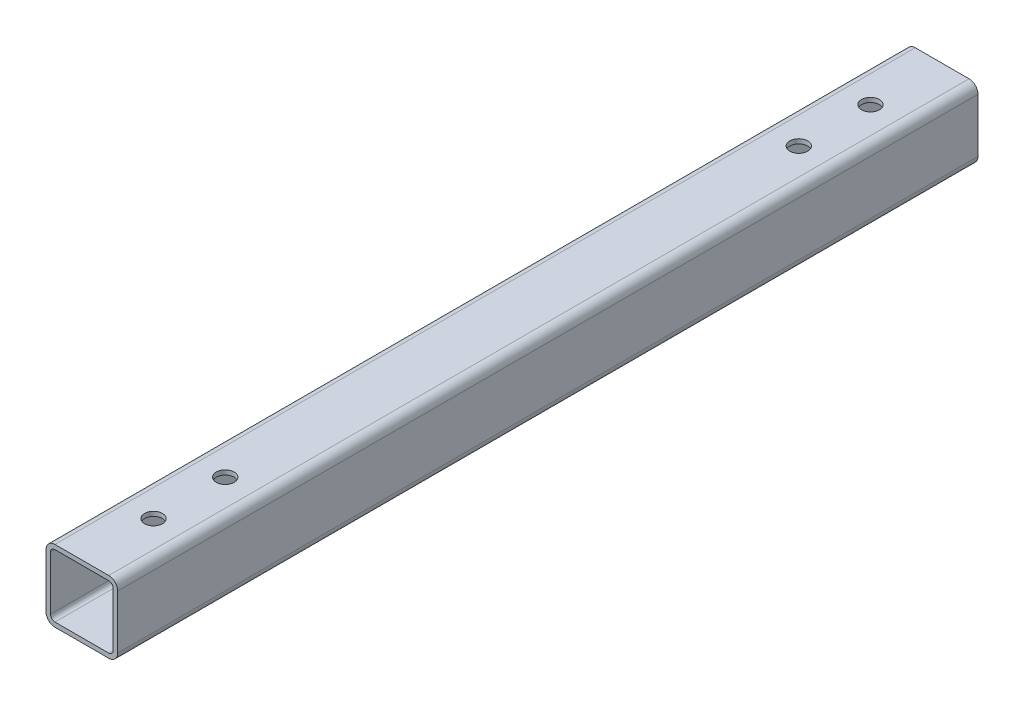
ISO-10303-21;
HEADER;
FILE_DESCRIPTION(('STEP AP214'),'2;1');
FILE_NAME('part.step','',(''),(''),'','','');
FILE_SCHEMA(('AUTOMOTIVE_DESIGN { 1 0 10303 214 1 1 1 1 }'));
ENDSEC;
DATA;
#1=APPLICATION_CONTEXT('core data for automotive mechanical design processes');
#2=APPLICATION_PROTOCOL_DEFINITION('international standard','automotive_design',2000,#1);
#3=PRODUCT_CONTEXT('',#1,'mechanical');
#4=PRODUCT('Part','Part','',(#3));
#5=PRODUCT_RELATED_PRODUCT_CATEGORY('part','',(#4));
#6=PRODUCT_DEFINITION_FORMATION('','',#4);
#7=PRODUCT_DEFINITION_CONTEXT('part definition',#1,'design');
#8=PRODUCT_DEFINITION('design','',#6,#7);
#9=PRODUCT_DEFINITION_SHAPE('','',#8);
#10=(LENGTH_UNIT() NAMED_UNIT(*) SI_UNIT(.MILLI.,.METRE.));
#11=(NAMED_UNIT(*) PLANE_ANGLE_UNIT() SI_UNIT($,.RADIAN.));
#12=(NAMED_UNIT(*) SI_UNIT($,.STERADIAN.) SOLID_ANGLE_UNIT());
#13=UNCERTAINTY_MEASURE_WITH_UNIT(LENGTH_MEASURE(1.E-05),#10,'distance_accuracy_value','');
#14=(GEOMETRIC_REPRESENTATION_CONTEXT(3) GLOBAL_UNCERTAINTY_ASSIGNED_CONTEXT((#13)) GLOBAL_UNIT_ASSIGNED_CONTEXT((#10,
#11,#12)) REPRESENTATION_CONTEXT('',''));
#15=CARTESIAN_POINT('',(0.,0.,0.));
#16=DIRECTION('',(0.,0.,1.));
#17=DIRECTION('',(1.,0.,0.));
#18=AXIS2_PLACEMENT_3D('',#15,#16,#17);
#19=CARTESIAN_POINT('',(-12.7,-12.7,-152.4));
#20=DIRECTION('',(0.,0.,-1.));
#21=DIRECTION('',(-1.,0.,0.));
#22=AXIS2_PLACEMENT_3D('',#19,#20,#21);
#23=PLANE('',#22);
#24=DIRECTION('',(0.,-1.,0.));
#25=VECTOR('',#24,1.);
#26=CARTESIAN_POINT('',(-12.7,12.7,-152.4));
#27=LINE('',#26,#25);
#28=CARTESIAN_POINT('',(-12.7,9.525,-152.4));
#29=VERTEX_POINT('',#28);
#30=CARTESIAN_POINT('',(-12.7,-9.525,-152.4));
#31=VERTEX_POINT('',#30);
#32=EDGE_CURVE('E232',#29,#31,#27,.T.);
#33=ORIENTED_EDGE('',*,*,#32,.F.);
#34=CARTESIAN_POINT('',(-9.525,9.525,-152.4));
#35=DIRECTION('',(0.,0.,-1.));
#36=DIRECTION('',(-1.,0.,0.));
#37=AXIS2_PLACEMENT_3D('',#34,#35,#36);
#38=CIRCLE('',#37,3.175);
#39=CARTESIAN_POINT('',(-9.525,12.7,-152.4));
#40=VERTEX_POINT('',#39);
#41=EDGE_CURVE('E258',#29,#40,#38,.T.);
#42=ORIENTED_EDGE('',*,*,#41,.T.);
#43=DIRECTION('',(1.,0.,0.));
#44=VECTOR('',#43,1.);
#45=CARTESIAN_POINT('',(-12.7,12.7,-152.4));
#46=LINE('',#45,#44);
#47=CARTESIAN_POINT('',(9.525,12.7,-152.4));
#48=VERTEX_POINT('',#47);
#49=EDGE_CURVE('E219',#40,#48,#46,.T.);
#50=ORIENTED_EDGE('',*,*,#49,.T.);
#51=CARTESIAN_POINT('',(9.525,9.525,-152.4));
#52=DIRECTION('',(0.,0.,-1.));
#53=DIRECTION('',(-1.,0.,0.));
#54=AXIS2_PLACEMENT_3D('',#51,#52,#53);
#55=CIRCLE('',#54,3.175);
#56=CARTESIAN_POINT('',(12.7,9.525,-152.4));
#57=VERTEX_POINT('',#56);
#58=EDGE_CURVE('E254',#48,#57,#55,.T.);
#59=ORIENTED_EDGE('',*,*,#58,.T.);
#60=DIRECTION('',(0.,1.,0.));
#61=VECTOR('',#60,1.);
#62=CARTESIAN_POINT('',(12.7,-12.7,-152.4));
#63=LINE('',#62,#61);
#64=CARTESIAN_POINT('',(12.7,-9.525,-152.4));
#65=VERTEX_POINT('',#64);
#66=EDGE_CURVE('E240',#65,#57,#63,.T.);
#67=ORIENTED_EDGE('',*,*,#66,.F.);
#68=CARTESIAN_POINT('',(9.525,-9.525,-152.4));
#69=DIRECTION('',(0.,0.,-1.));
#70=DIRECTION('',(-1.,0.,0.));
#71=AXIS2_PLACEMENT_3D('',#68,#69,#70);
#72=CIRCLE('',#71,3.175);
#73=CARTESIAN_POINT('',(9.525,-12.7,-152.4));
#74=VERTEX_POINT('',#73);
#75=EDGE_CURVE('E252',#65,#74,#72,.T.);
#76=ORIENTED_EDGE('',*,*,#75,.T.);
#77=DIRECTION('',(-1.,0.,0.));
#78=VECTOR('',#77,1.);
#79=CARTESIAN_POINT('',(12.7,-12.7,-152.4));
#80=LINE('',#79,#78);
#81=CARTESIAN_POINT('',(-9.52499999999999,-12.7,-152.4));
#82=VERTEX_POINT('',#81);
#83=EDGE_CURVE('E236',#74,#82,#80,.T.);
#84=ORIENTED_EDGE('',*,*,#83,.T.);
#85=CARTESIAN_POINT('',(-9.52499999999999,-9.525,-152.4));
#86=DIRECTION('',(0.,0.,-1.));
#87=DIRECTION('',(-1.,0.,0.));
#88=AXIS2_PLACEMENT_3D('',#85,#86,#87);
#89=CIRCLE('',#88,3.175);
#90=EDGE_CURVE('E256',#82,#31,#89,.T.);
#91=ORIENTED_EDGE('',*,*,#90,.T.);
#92=EDGE_LOOP('',(#33,#42,#50,#59,#67,#76,#84,#91));
#93=FACE_BOUND('',#92,.T.);
#94=CARTESIAN_POINT('',(-9.525,9.525,-152.4));
#95=DIRECTION('',(0.,0.,-1.));
#96=DIRECTION('',(-1.,0.,0.));
#97=AXIS2_PLACEMENT_3D('',#94,#95,#96);
#98=CIRCLE('',#97,1.5875);
#99=CARTESIAN_POINT('',(-11.1125,9.525,-152.4));
#100=VERTEX_POINT('',#99);
#101=CARTESIAN_POINT('',(-9.525,11.1125,-152.4));
#102=VERTEX_POINT('',#101);
#103=EDGE_CURVE('E200',#100,#102,#98,.T.);
#104=ORIENTED_EDGE('',*,*,#103,.F.);
#105=DIRECTION('',(0.,-1.,0.));
#106=VECTOR('',#105,1.);
#107=CARTESIAN_POINT('',(-11.1125,-12.7,-152.4));
#108=LINE('',#107,#106);
#109=CARTESIAN_POINT('',(-11.1125,-9.525,-152.4));
#110=VERTEX_POINT('',#109);
#111=EDGE_CURVE('E197',#100,#110,#108,.T.);
#112=ORIENTED_EDGE('',*,*,#111,.T.);
#113=CARTESIAN_POINT('',(-9.52499999999999,-9.525,-152.4));
#114=DIRECTION('',(0.,0.,-1.));
#115=DIRECTION('',(-1.,0.,0.));
#116=AXIS2_PLACEMENT_3D('',#113,#114,#115);
#117=CIRCLE('',#116,1.5875);
#118=CARTESIAN_POINT('',(-9.52499999999999,-11.1125,-152.4));
#119=VERTEX_POINT('',#118);
#120=EDGE_CURVE('E158',#119,#110,#117,.T.);
#121=ORIENTED_EDGE('',*,*,#120,.F.);
#122=DIRECTION('',(-1.,0.,0.));
#123=VECTOR('',#122,1.);
#124=CARTESIAN_POINT('',(-12.7,-11.1125,-152.4));
#125=LINE('',#124,#123);
#126=CARTESIAN_POINT('',(9.525,-11.1125,-152.4));
#127=VERTEX_POINT('',#126);
#128=EDGE_CURVE('E60',#127,#119,#125,.T.);
#129=ORIENTED_EDGE('',*,*,#128,.F.);
#130=CARTESIAN_POINT('',(9.525,-9.525,-152.4));
#131=DIRECTION('',(0.,0.,-1.));
#132=DIRECTION('',(-1.,0.,0.));
#133=AXIS2_PLACEMENT_3D('',#130,#131,#132);
#134=CIRCLE('',#133,1.5875);
#135=CARTESIAN_POINT('',(11.1125,-9.525,-152.4));
#136=VERTEX_POINT('',#135);
#137=EDGE_CURVE('E208',#136,#127,#134,.T.);
#138=ORIENTED_EDGE('',*,*,#137,.F.);
#139=DIRECTION('',(0.,1.,0.));
#140=VECTOR('',#139,1.);
#141=CARTESIAN_POINT('',(11.1125,-12.7,-152.4));
#142=LINE('',#141,#140);
#143=CARTESIAN_POINT('',(11.1125,9.52499999999999,-152.4));
#144=VERTEX_POINT('',#143);
#145=EDGE_CURVE('E205',#136,#144,#142,.T.);
#146=ORIENTED_EDGE('',*,*,#145,.T.);
#147=CARTESIAN_POINT('',(9.525,9.525,-152.4));
#148=DIRECTION('',(0.,0.,-1.));
#149=DIRECTION('',(-1.,0.,0.));
#150=AXIS2_PLACEMENT_3D('',#147,#148,#149);
#151=CIRCLE('',#150,1.5875);
#152=CARTESIAN_POINT('',(9.525,11.1125,-152.4));
#153=VERTEX_POINT('',#152);
#154=EDGE_CURVE('E206',#153,#144,#151,.T.);
#155=ORIENTED_EDGE('',*,*,#154,.F.);
#156=DIRECTION('',(1.,0.,0.));
#157=VECTOR('',#156,1.);
#158=CARTESIAN_POINT('',(-12.7,11.1125,-152.4));
#159=LINE('',#158,#157);
#160=EDGE_CURVE('E173',#102,#153,#159,.T.);
#161=ORIENTED_EDGE('',*,*,#160,.F.);
#162=EDGE_LOOP('',(#104,#112,#121,#129,#138,#146,#155,#161));
#163=FACE_BOUND('',#162,.T.);
#164=ADVANCED_FACE('F34',(#93,#163),#23,.T.);
#165=CARTESIAN_POINT('',(-12.7,12.7,152.4));
#166=DIRECTION('',(1.,0.,0.));
#167=DIRECTION('',(0.,1.,0.));
#168=AXIS2_PLACEMENT_3D('',#165,#166,#167);
#169=PLANE('',#168);
#170=DIRECTION('',(0.,-1.,0.));
#171=VECTOR('',#170,1.);
#172=CARTESIAN_POINT('',(-12.7,12.7,152.4));
#173=LINE('',#172,#171);
#174=CARTESIAN_POINT('',(-12.7,9.525,152.4));
#175=VERTEX_POINT('',#174);
#176=CARTESIAN_POINT('',(-12.7,-9.525,152.4));
#177=VERTEX_POINT('',#176);
#178=EDGE_CURVE('E215',#175,#177,#173,.T.);
#179=ORIENTED_EDGE('',*,*,#178,.F.);
#180=DIRECTION('',(0.,0.,-1.));
#181=VECTOR('',#180,1.);
#182=CARTESIAN_POINT('',(-12.7,9.525,-152.4));
#183=LINE('',#182,#181);
#184=EDGE_CURVE('E248',#175,#29,#183,.T.);
#185=ORIENTED_EDGE('',*,*,#184,.T.);
#186=ORIENTED_EDGE('',*,*,#32,.T.);
#187=DIRECTION('',(0.,0.,-1.));
#188=VECTOR('',#187,1.);
#189=CARTESIAN_POINT('',(-12.7,-9.525,152.4));
#190=LINE('',#189,#188);
#191=EDGE_CURVE('E231',#31,#177,#190,.F.);
#192=ORIENTED_EDGE('',*,*,#191,.T.);
#193=EDGE_LOOP('',(#179,#185,#186,#192));
#194=FACE_BOUND('',#193,.T.);
#195=ADVANCED_FACE('F375',(#194),#169,.F.);
#196=CARTESIAN_POINT('',(12.7,-12.7,152.4));
#197=DIRECTION('',(0.,-1.,0.));
#198=DIRECTION('',(1.,0.,0.));
#199=AXIS2_PLACEMENT_3D('',#196,#197,#198);
#200=PLANE('',#199);
#201=CARTESIAN_POINT('',(0.,-12.7,-101.6));
#202=DIRECTION('',(0.,-1.,0.));
#203=DIRECTION('',(1.,0.,0.));
#204=AXIS2_PLACEMENT_3D('',#201,#202,#203);
#205=CIRCLE('',#204,3.17499999999998);
#206=CARTESIAN_POINT('',(3.17499999999998,-12.7,-101.6));
#207=VERTEX_POINT('',#206);
#208=EDGE_CURVE('E624',#207,#207,#205,.T.);
#209=ORIENTED_EDGE('',*,*,#208,.F.);
#210=EDGE_LOOP('',(#209));
#211=FACE_BOUND('',#210,.T.);
#212=CARTESIAN_POINT('',(0.,-12.7,-127.));
#213=DIRECTION('',(0.,-1.,0.));
#214=DIRECTION('',(1.,0.,0.));
#215=AXIS2_PLACEMENT_3D('',#212,#213,#214);
#216=CIRCLE('',#215,3.17499999999998);
#217=CARTESIAN_POINT('',(3.17499999999998,-12.7,-127.));
#218=VERTEX_POINT('',#217);
#219=EDGE_CURVE('E303',#218,#218,#216,.T.);
#220=ORIENTED_EDGE('',*,*,#219,.F.);
#221=EDGE_LOOP('',(#220));
#222=FACE_BOUND('',#221,.T.);
#223=CARTESIAN_POINT('',(0.,-12.7,101.6));
#224=DIRECTION('',(0.,-1.,0.));
#225=DIRECTION('',(1.,0.,0.));
#226=AXIS2_PLACEMENT_3D('',#223,#224,#225);
#227=CIRCLE('',#226,3.17499999999998);
#228=CARTESIAN_POINT('',(3.17499999999998,-12.7,101.6));
#229=VERTEX_POINT('',#228);
#230=EDGE_CURVE('E300',#229,#229,#227,.T.);
#231=ORIENTED_EDGE('',*,*,#230,.F.);
#232=EDGE_LOOP('',(#231));
#233=FACE_BOUND('',#232,.T.);
#234=CARTESIAN_POINT('',(0.,-12.7,127.));
#235=DIRECTION('',(0.,-1.,0.));
#236=DIRECTION('',(1.,0.,0.));
#237=AXIS2_PLACEMENT_3D('',#234,#235,#236);
#238=CIRCLE('',#237,3.17499999999999);
#239=CARTESIAN_POINT('',(3.17499999999998,-12.7,127.));
#240=VERTEX_POINT('',#239);
#241=EDGE_CURVE('E319',#240,#240,#238,.T.);
#242=ORIENTED_EDGE('',*,*,#241,.F.);
#243=EDGE_LOOP('',(#242));
#244=FACE_BOUND('',#243,.T.);
#245=DIRECTION('',(-1.,0.,0.));
#246=VECTOR('',#245,1.);
#247=CARTESIAN_POINT('',(12.7,-12.7,152.4));
#248=LINE('',#247,#246);
#249=CARTESIAN_POINT('',(9.525,-12.7,152.4));
#250=VERTEX_POINT('',#249);
#251=CARTESIAN_POINT('',(-9.52499999999999,-12.7,152.4));
#252=VERTEX_POINT('',#251);
#253=EDGE_CURVE('E218',#250,#252,#248,.T.);
#254=ORIENTED_EDGE('',*,*,#253,.T.);
#255=DIRECTION('',(0.,0.,-1.));
#256=VECTOR('',#255,1.);
#257=CARTESIAN_POINT('',(-9.52499999999999,-12.7,-152.4));
#258=LINE('',#257,#256);
#259=EDGE_CURVE('E278',#252,#82,#258,.T.);
#260=ORIENTED_EDGE('',*,*,#259,.T.);
#261=ORIENTED_EDGE('',*,*,#83,.F.);
#262=DIRECTION('',(0.,0.,-1.));
#263=VECTOR('',#262,1.);
#264=CARTESIAN_POINT('',(9.525,-12.7,152.4));
#265=LINE('',#264,#263);
#266=EDGE_CURVE('E275',#74,#250,#265,.F.);
#267=ORIENTED_EDGE('',*,*,#266,.T.);
#268=EDGE_LOOP('',(#254,#260,#261,#267));
#269=FACE_BOUND('',#268,.T.);
#270=ADVANCED_FACE('F380',(#211,#222,#233,#244,#269),#200,.T.);
#271=CARTESIAN_POINT('',(12.7,-12.7,152.4));
#272=DIRECTION('',(-1.,0.,0.));
#273=DIRECTION('',(0.,0.,1.));
#274=AXIS2_PLACEMENT_3D('',#271,#272,#273);
#275=PLANE('',#274);
#276=ORIENTED_EDGE('',*,*,#66,.T.);
#277=DIRECTION('',(0.,0.,-1.));
#278=VECTOR('',#277,1.);
#279=CARTESIAN_POINT('',(12.7,9.525,152.4));
#280=LINE('',#279,#278);
#281=CARTESIAN_POINT('',(12.7,9.525,152.4));
#282=VERTEX_POINT('',#281);
#283=EDGE_CURVE('E11',#57,#282,#280,.F.);
#284=ORIENTED_EDGE('',*,*,#283,.T.);
#285=DIRECTION('',(0.,1.,0.));
#286=VECTOR('',#285,1.);
#287=CARTESIAN_POINT('',(12.7,-12.7,152.4));
#288=LINE('',#287,#286);
#289=CARTESIAN_POINT('',(12.7,-9.525,152.4));
#290=VERTEX_POINT('',#289);
#291=EDGE_CURVE('E223',#290,#282,#288,.T.);
#292=ORIENTED_EDGE('',*,*,#291,.F.);
#293=DIRECTION('',(0.,0.,-1.));
#294=VECTOR('',#293,1.);
#295=CARTESIAN_POINT('',(12.7,-9.525,-152.4));
#296=LINE('',#295,#294);
#297=EDGE_CURVE('E44',#290,#65,#296,.T.);
#298=ORIENTED_EDGE('',*,*,#297,.T.);
#299=EDGE_LOOP('',(#276,#284,#292,#298));
#300=FACE_BOUND('',#299,.T.);
#301=ADVANCED_FACE('F390',(#300),#275,.F.);
#302=CARTESIAN_POINT('',(-12.7,12.7,152.4));
#303=DIRECTION('',(0.,1.,0.));
#304=DIRECTION('',(-1.,0.,0.));
#305=AXIS2_PLACEMENT_3D('',#302,#303,#304);
#306=PLANE('',#305);
#307=CARTESIAN_POINT('',(0.,12.7,-101.6));
#308=DIRECTION('',(0.,-1.,0.));
#309=DIRECTION('',(1.,0.,0.));
#310=AXIS2_PLACEMENT_3D('',#307,#308,#309);
#311=CIRCLE('',#310,3.17499999999998);
#312=CARTESIAN_POINT('',(3.17499999999999,12.7,-101.6));
#313=VERTEX_POINT('',#312);
#314=EDGE_CURVE('E627',#313,#313,#311,.T.);
#315=ORIENTED_EDGE('',*,*,#314,.T.);
#316=EDGE_LOOP('',(#315));
#317=FACE_BOUND('',#316,.T.);
#318=CARTESIAN_POINT('',(0.,12.7,-127.));
#319=DIRECTION('',(0.,-1.,0.));
#320=DIRECTION('',(1.,0.,0.));
#321=AXIS2_PLACEMENT_3D('',#318,#319,#320);
#322=CIRCLE('',#321,3.17499999999998);
#323=CARTESIAN_POINT('',(3.17499999999999,12.7,-127.));
#324=VERTEX_POINT('',#323);
#325=EDGE_CURVE('E296',#324,#324,#322,.T.);
#326=ORIENTED_EDGE('',*,*,#325,.T.);
#327=EDGE_LOOP('',(#326));
#328=FACE_BOUND('',#327,.T.);
#329=CARTESIAN_POINT('',(0.,12.7,101.6));
#330=DIRECTION('',(0.,-1.,0.));
#331=DIRECTION('',(1.,0.,0.));
#332=AXIS2_PLACEMENT_3D('',#329,#330,#331);
#333=CIRCLE('',#332,3.17499999999998);
#334=CARTESIAN_POINT('',(3.17499999999999,12.7,101.6));
#335=VERTEX_POINT('',#334);
#336=EDGE_CURVE('E292',#335,#335,#333,.T.);
#337=ORIENTED_EDGE('',*,*,#336,.T.);
#338=EDGE_LOOP('',(#337));
#339=FACE_BOUND('',#338,.T.);
#340=CARTESIAN_POINT('',(0.,12.7,127.));
#341=DIRECTION('',(0.,-1.,0.));
#342=DIRECTION('',(1.,0.,0.));
#343=AXIS2_PLACEMENT_3D('',#340,#341,#342);
#344=CIRCLE('',#343,3.17499999999999);
#345=CARTESIAN_POINT('',(3.17499999999999,12.7,127.));
#346=VERTEX_POINT('',#345);
#347=EDGE_CURVE('E288',#346,#346,#344,.T.);
#348=ORIENTED_EDGE('',*,*,#347,.T.);
#349=EDGE_LOOP('',(#348));
#350=FACE_BOUND('',#349,.T.);
#351=ORIENTED_EDGE('',*,*,#49,.F.);
#352=DIRECTION('',(0.,0.,-1.));
#353=VECTOR('',#352,1.);
#354=CARTESIAN_POINT('',(-9.525,12.7,152.4));
#355=LINE('',#354,#353);
#356=CARTESIAN_POINT('',(-9.525,12.7,152.4));
#357=VERTEX_POINT('',#356);
#358=EDGE_CURVE('E264',#40,#357,#355,.F.);
#359=ORIENTED_EDGE('',*,*,#358,.T.);
#360=DIRECTION('',(1.,0.,0.));
#361=VECTOR('',#360,1.);
#362=CARTESIAN_POINT('',(-12.7,12.7,152.4));
#363=LINE('',#362,#361);
#364=CARTESIAN_POINT('',(9.525,12.7,152.4));
#365=VERTEX_POINT('',#364);
#366=EDGE_CURVE('E227',#357,#365,#363,.T.);
#367=ORIENTED_EDGE('',*,*,#366,.T.);
#368=DIRECTION('',(0.,0.,-1.));
#369=VECTOR('',#368,1.);
#370=CARTESIAN_POINT('',(9.525,12.7,-152.4));
#371=LINE('',#370,#369);
#372=EDGE_CURVE('E260',#365,#48,#371,.T.);
#373=ORIENTED_EDGE('',*,*,#372,.T.);
#374=EDGE_LOOP('',(#351,#359,#367,#373));
#375=FACE_BOUND('',#374,.T.);
#376=ADVANCED_FACE('F387',(#317,#328,#339,#350,#375),#306,.T.);
#377=CARTESIAN_POINT('',(-12.7,-12.7,152.4));
#378=DIRECTION('',(0.,0.,-1.));
#379=DIRECTION('',(-1.,0.,0.));
#380=AXIS2_PLACEMENT_3D('',#377,#378,#379);
#381=PLANE('',#380);
#382=CARTESIAN_POINT('',(-9.525,9.525,152.4));
#383=DIRECTION('',(0.,0.,-1.));
#384=DIRECTION('',(-1.,0.,0.));
#385=AXIS2_PLACEMENT_3D('',#382,#383,#384);
#386=CIRCLE('',#385,1.5875);
#387=CARTESIAN_POINT('',(-9.525,11.1125,152.4));
#388=VERTEX_POINT('',#387);
#389=CARTESIAN_POINT('',(-11.1125,9.525,152.4));
#390=VERTEX_POINT('',#389);
#391=EDGE_CURVE('E180',#388,#390,#386,.F.);
#392=ORIENTED_EDGE('',*,*,#391,.F.);
#393=DIRECTION('',(1.,0.,0.));
#394=VECTOR('',#393,1.);
#395=CARTESIAN_POINT('',(-12.7,11.1125,152.4));
#396=LINE('',#395,#394);
#397=CARTESIAN_POINT('',(9.525,11.1125,152.4));
#398=VERTEX_POINT('',#397);
#399=EDGE_CURVE('E164',#388,#398,#396,.T.);
#400=ORIENTED_EDGE('',*,*,#399,.T.);
#401=CARTESIAN_POINT('',(9.525,9.525,152.4));
#402=DIRECTION('',(0.,0.,-1.));
#403=DIRECTION('',(-1.,0.,0.));
#404=AXIS2_PLACEMENT_3D('',#401,#402,#403);
#405=CIRCLE('',#404,1.5875);
#406=CARTESIAN_POINT('',(11.1125,9.52499999999999,152.4));
#407=VERTEX_POINT('',#406);
#408=EDGE_CURVE('E181',#407,#398,#405,.F.);
#409=ORIENTED_EDGE('',*,*,#408,.F.);
#410=DIRECTION('',(0.,1.,0.));
#411=VECTOR('',#410,1.);
#412=CARTESIAN_POINT('',(11.1125,-12.7,152.4));
#413=LINE('',#412,#411);
#414=CARTESIAN_POINT('',(11.1125,-9.525,152.4));
#415=VERTEX_POINT('',#414);
#416=EDGE_CURVE('E52',#415,#407,#413,.T.);
#417=ORIENTED_EDGE('',*,*,#416,.F.);
#418=CARTESIAN_POINT('',(9.525,-9.525,152.4));
#419=DIRECTION('',(0.,0.,-1.));
#420=DIRECTION('',(-1.,0.,0.));
#421=AXIS2_PLACEMENT_3D('',#418,#419,#420);
#422=CIRCLE('',#421,1.5875);
#423=CARTESIAN_POINT('',(9.525,-11.1125,152.4));
#424=VERTEX_POINT('',#423);
#425=EDGE_CURVE('E185',#424,#415,#422,.F.);
#426=ORIENTED_EDGE('',*,*,#425,.F.);
#427=DIRECTION('',(-1.,0.,0.));
#428=VECTOR('',#427,1.);
#429=CARTESIAN_POINT('',(-12.7,-11.1125,152.4));
#430=LINE('',#429,#428);
#431=CARTESIAN_POINT('',(-9.52499999999999,-11.1125,152.4));
#432=VERTEX_POINT('',#431);
#433=EDGE_CURVE('E172',#424,#432,#430,.T.);
#434=ORIENTED_EDGE('',*,*,#433,.T.);
#435=CARTESIAN_POINT('',(-9.52499999999999,-9.525,152.4));
#436=DIRECTION('',(0.,0.,-1.));
#437=DIRECTION('',(-1.,0.,0.));
#438=AXIS2_PLACEMENT_3D('',#435,#436,#437);
#439=CIRCLE('',#438,1.5875);
#440=CARTESIAN_POINT('',(-11.1125,-9.525,152.4));
#441=VERTEX_POINT('',#440);
#442=EDGE_CURVE('E156',#441,#432,#439,.F.);
#443=ORIENTED_EDGE('',*,*,#442,.F.);
#444=DIRECTION('',(0.,-1.,0.));
#445=VECTOR('',#444,1.);
#446=CARTESIAN_POINT('',(-11.1125,-12.7,152.4));
#447=LINE('',#446,#445);
#448=EDGE_CURVE('E168',#390,#441,#447,.T.);
#449=ORIENTED_EDGE('',*,*,#448,.F.);
#450=EDGE_LOOP('',(#392,#400,#409,#417,#426,#434,#443,#449));
#451=FACE_BOUND('',#450,.T.);
#452=ORIENTED_EDGE('',*,*,#366,.F.);
#453=CARTESIAN_POINT('',(-9.525,9.525,152.4));
#454=DIRECTION('',(0.,0.,-1.));
#455=DIRECTION('',(-1.,0.,0.));
#456=AXIS2_PLACEMENT_3D('',#453,#454,#455);
#457=CIRCLE('',#456,3.175);
#458=EDGE_CURVE('E273',#357,#175,#457,.F.);
#459=ORIENTED_EDGE('',*,*,#458,.T.);
#460=ORIENTED_EDGE('',*,*,#178,.T.);
#461=CARTESIAN_POINT('',(-9.52499999999999,-9.525,152.4));
#462=DIRECTION('',(0.,0.,-1.));
#463=DIRECTION('',(-1.,0.,0.));
#464=AXIS2_PLACEMENT_3D('',#461,#462,#463);
#465=CIRCLE('',#464,3.175);
#466=EDGE_CURVE('E271',#177,#252,#465,.F.);
#467=ORIENTED_EDGE('',*,*,#466,.T.);
#468=ORIENTED_EDGE('',*,*,#253,.F.);
#469=CARTESIAN_POINT('',(9.525,-9.525,152.4));
#470=DIRECTION('',(0.,0.,-1.));
#471=DIRECTION('',(-1.,0.,0.));
#472=AXIS2_PLACEMENT_3D('',#469,#470,#471);
#473=CIRCLE('',#472,3.175);
#474=EDGE_CURVE('E267',#250,#290,#473,.F.);
#475=ORIENTED_EDGE('',*,*,#474,.T.);
#476=ORIENTED_EDGE('',*,*,#291,.T.);
#477=CARTESIAN_POINT('',(9.525,9.525,152.4));
#478=DIRECTION('',(0.,0.,-1.));
#479=DIRECTION('',(-1.,0.,0.));
#480=AXIS2_PLACEMENT_3D('',#477,#478,#479);
#481=CIRCLE('',#480,3.175);
#482=EDGE_CURVE('E269',#282,#365,#481,.F.);
#483=ORIENTED_EDGE('',*,*,#482,.T.);
#484=EDGE_LOOP('',(#452,#459,#460,#467,#468,#475,#476,#483));
#485=FACE_BOUND('',#484,.T.);
#486=ADVANCED_FACE('F176',(#451,#485),#381,.F.);
#487=CARTESIAN_POINT('',(-9.525,9.525,152.4));
#488=DIRECTION('',(0.,0.,1.));
#489=DIRECTION('',(1.,0.,0.));
#490=AXIS2_PLACEMENT_3D('',#487,#488,#489);
#491=CYLINDRICAL_SURFACE('',#490,3.175);
#492=ORIENTED_EDGE('',*,*,#458,.F.);
#493=ORIENTED_EDGE('',*,*,#358,.F.);
#494=ORIENTED_EDGE('',*,*,#41,.F.);
#495=ORIENTED_EDGE('',*,*,#184,.F.);
#496=EDGE_LOOP('',(#492,#493,#494,#495));
#497=FACE_BOUND('',#496,.T.);
#498=ADVANCED_FACE('F398',(#497),#491,.T.);
#499=CARTESIAN_POINT('',(-9.52499999999999,-9.525,152.4));
#500=DIRECTION('',(0.,0.,1.));
#501=DIRECTION('',(1.,0.,0.));
#502=AXIS2_PLACEMENT_3D('',#499,#500,#501);
#503=CYLINDRICAL_SURFACE('',#502,3.175);
#504=ORIENTED_EDGE('',*,*,#466,.F.);
#505=ORIENTED_EDGE('',*,*,#191,.F.);
#506=ORIENTED_EDGE('',*,*,#90,.F.);
#507=ORIENTED_EDGE('',*,*,#259,.F.);
#508=EDGE_LOOP('',(#504,#505,#506,#507));
#509=FACE_BOUND('',#508,.T.);
#510=ADVANCED_FACE('F401',(#509),#503,.T.);
#511=CARTESIAN_POINT('',(9.525,9.525,152.4));
#512=DIRECTION('',(0.,0.,1.));
#513=DIRECTION('',(1.,0.,0.));
#514=AXIS2_PLACEMENT_3D('',#511,#512,#513);
#515=CYLINDRICAL_SURFACE('',#514,3.175);
#516=ORIENTED_EDGE('',*,*,#482,.F.);
#517=ORIENTED_EDGE('',*,*,#283,.F.);
#518=ORIENTED_EDGE('',*,*,#58,.F.);
#519=ORIENTED_EDGE('',*,*,#372,.F.);
#520=EDGE_LOOP('',(#516,#517,#518,#519));
#521=FACE_BOUND('',#520,.T.);
#522=ADVANCED_FACE('F404',(#521),#515,.T.);
#523=CARTESIAN_POINT('',(9.525,-9.525,152.4));
#524=DIRECTION('',(0.,0.,1.));
#525=DIRECTION('',(1.,0.,0.));
#526=AXIS2_PLACEMENT_3D('',#523,#524,#525);
#527=CYLINDRICAL_SURFACE('',#526,3.175);
#528=ORIENTED_EDGE('',*,*,#474,.F.);
#529=ORIENTED_EDGE('',*,*,#266,.F.);
#530=ORIENTED_EDGE('',*,*,#75,.F.);
#531=ORIENTED_EDGE('',*,*,#297,.F.);
#532=EDGE_LOOP('',(#528,#529,#530,#531));
#533=FACE_BOUND('',#532,.T.);
#534=ADVANCED_FACE('F36',(#533),#527,.T.);
#535=CARTESIAN_POINT('',(-11.1125,12.7,152.4));
#536=DIRECTION('',(1.,0.,0.));
#537=DIRECTION('',(0.,1.,0.));
#538=AXIS2_PLACEMENT_3D('',#535,#536,#537);
#539=PLANE('',#538);
#540=ORIENTED_EDGE('',*,*,#448,.T.);
#541=DIRECTION('',(0.,0.,1.));
#542=VECTOR('',#541,1.);
#543=CARTESIAN_POINT('',(-11.1125,-9.525,152.4));
#544=LINE('',#543,#542);
#545=EDGE_CURVE('E152',#110,#441,#544,.T.);
#546=ORIENTED_EDGE('',*,*,#545,.F.);
#547=ORIENTED_EDGE('',*,*,#111,.F.);
#548=DIRECTION('',(0.,0.,1.));
#549=VECTOR('',#548,1.);
#550=CARTESIAN_POINT('',(-11.1125,9.525,152.4));
#551=LINE('',#550,#549);
#552=EDGE_CURVE('E163',#390,#100,#551,.F.);
#553=ORIENTED_EDGE('',*,*,#552,.F.);
#554=EDGE_LOOP('',(#540,#546,#547,#553));
#555=FACE_BOUND('',#554,.T.);
#556=ADVANCED_FACE('F169',(#555),#539,.T.);
#557=CARTESIAN_POINT('',(12.7,-11.1125,152.4));
#558=DIRECTION('',(0.,-1.,0.));
#559=DIRECTION('',(1.,0.,0.));
#560=AXIS2_PLACEMENT_3D('',#557,#558,#559);
#561=PLANE('',#560);
#562=CARTESIAN_POINT('',(0.,-11.1125,-101.6));
#563=DIRECTION('',(0.,-1.,0.));
#564=DIRECTION('',(1.,0.,0.));
#565=AXIS2_PLACEMENT_3D('',#562,#563,#564);
#566=CIRCLE('',#565,3.17499999999998);
#567=CARTESIAN_POINT('',(3.17499999999998,-11.1125,-101.6));
#568=VERTEX_POINT('',#567);
#569=EDGE_CURVE('E308',#568,#568,#566,.T.);
#570=ORIENTED_EDGE('',*,*,#569,.T.);
#571=EDGE_LOOP('',(#570));
#572=FACE_BOUND('',#571,.T.);
#573=CARTESIAN_POINT('',(0.,-11.1125,-127.));
#574=DIRECTION('',(0.,-1.,0.));
#575=DIRECTION('',(1.,0.,0.));
#576=AXIS2_PLACEMENT_3D('',#573,#574,#575);
#577=CIRCLE('',#576,3.17499999999998);
#578=CARTESIAN_POINT('',(3.17499999999998,-11.1125,-127.));
#579=VERTEX_POINT('',#578);
#580=EDGE_CURVE('E295',#579,#579,#577,.T.);
#581=ORIENTED_EDGE('',*,*,#580,.T.);
#582=EDGE_LOOP('',(#581));
#583=FACE_BOUND('',#582,.T.);
#584=CARTESIAN_POINT('',(0.,-11.1125,101.6));
#585=DIRECTION('',(0.,-1.,0.));
#586=DIRECTION('',(1.,0.,0.));
#587=AXIS2_PLACEMENT_3D('',#584,#585,#586);
#588=CIRCLE('',#587,3.17499999999998);
#589=CARTESIAN_POINT('',(3.17499999999998,-11.1125,101.6));
#590=VERTEX_POINT('',#589);
#591=EDGE_CURVE('E291',#590,#590,#588,.T.);
#592=ORIENTED_EDGE('',*,*,#591,.T.);
#593=EDGE_LOOP('',(#592));
#594=FACE_BOUND('',#593,.T.);
#595=CARTESIAN_POINT('',(0.,-11.1125,127.));
#596=DIRECTION('',(0.,-1.,0.));
#597=DIRECTION('',(1.,0.,0.));
#598=AXIS2_PLACEMENT_3D('',#595,#596,#597);
#599=CIRCLE('',#598,3.17499999999999);
#600=CARTESIAN_POINT('',(3.17499999999998,-11.1125,127.));
#601=VERTEX_POINT('',#600);
#602=EDGE_CURVE('E199',#601,#601,#599,.T.);
#603=ORIENTED_EDGE('',*,*,#602,.T.);
#604=EDGE_LOOP('',(#603));
#605=FACE_BOUND('',#604,.T.);
#606=ORIENTED_EDGE('',*,*,#433,.F.);
#607=DIRECTION('',(0.,0.,1.));
#608=VECTOR('',#607,1.);
#609=CARTESIAN_POINT('',(9.525,-11.1125,152.4));
#610=LINE('',#609,#608);
#611=EDGE_CURVE('E183',#127,#424,#610,.T.);
#612=ORIENTED_EDGE('',*,*,#611,.F.);
#613=ORIENTED_EDGE('',*,*,#128,.T.);
#614=DIRECTION('',(0.,0.,1.));
#615=VECTOR('',#614,1.);
#616=CARTESIAN_POINT('',(-9.52499999999999,-11.1125,152.4));
#617=LINE('',#616,#615);
#618=EDGE_CURVE('E337',#432,#119,#617,.F.);
#619=ORIENTED_EDGE('',*,*,#618,.F.);
#620=EDGE_LOOP('',(#606,#612,#613,#619));
#621=FACE_BOUND('',#620,.T.);
#622=ADVANCED_FACE('F362',(#572,#583,#594,#605,#621),#561,.F.);
#623=CARTESIAN_POINT('',(11.1125,-12.7,152.4));
#624=DIRECTION('',(-1.,0.,0.));
#625=DIRECTION('',(0.,0.,1.));
#626=AXIS2_PLACEMENT_3D('',#623,#624,#625);
#627=PLANE('',#626);
#628=ORIENTED_EDGE('',*,*,#145,.F.);
#629=DIRECTION('',(0.,0.,1.));
#630=VECTOR('',#629,1.);
#631=CARTESIAN_POINT('',(11.1125,-9.525,152.4));
#632=LINE('',#631,#630);
#633=EDGE_CURVE('E334',#415,#136,#632,.F.);
#634=ORIENTED_EDGE('',*,*,#633,.F.);
#635=ORIENTED_EDGE('',*,*,#416,.T.);
#636=DIRECTION('',(0.,0.,1.));
#637=VECTOR('',#636,1.);
#638=CARTESIAN_POINT('',(11.1125,9.52499999999999,152.4));
#639=LINE('',#638,#637);
#640=EDGE_CURVE('E237',#144,#407,#639,.T.);
#641=ORIENTED_EDGE('',*,*,#640,.F.);
#642=EDGE_LOOP('',(#628,#634,#635,#641));
#643=FACE_BOUND('',#642,.T.);
#644=ADVANCED_FACE('F359',(#643),#627,.T.);
#645=CARTESIAN_POINT('',(-12.7,11.1125,152.4));
#646=DIRECTION('',(0.,1.,0.));
#647=DIRECTION('',(-1.,0.,0.));
#648=AXIS2_PLACEMENT_3D('',#645,#646,#647);
#649=PLANE('',#648);
#650=CARTESIAN_POINT('',(0.,11.1125,-101.6));
#651=DIRECTION('',(0.,1.,0.));
#652=DIRECTION('',(-1.,0.,0.));
#653=AXIS2_PLACEMENT_3D('',#650,#651,#652);
#654=CIRCLE('',#653,3.17499999999998);
#655=CARTESIAN_POINT('',(-3.17499999999998,11.1125,-101.6));
#656=VERTEX_POINT('',#655);
#657=EDGE_CURVE('E38',#656,#656,#654,.T.);
#658=ORIENTED_EDGE('',*,*,#657,.T.);
#659=EDGE_LOOP('',(#658));
#660=FACE_BOUND('',#659,.T.);
#661=CARTESIAN_POINT('',(0.,11.1125,-127.));
#662=DIRECTION('',(0.,1.,0.));
#663=DIRECTION('',(-1.,0.,0.));
#664=AXIS2_PLACEMENT_3D('',#661,#662,#663);
#665=CIRCLE('',#664,3.17499999999998);
#666=CARTESIAN_POINT('',(-3.17499999999998,11.1125,-127.));
#667=VERTEX_POINT('',#666);
#668=EDGE_CURVE('E293',#667,#667,#665,.T.);
#669=ORIENTED_EDGE('',*,*,#668,.T.);
#670=EDGE_LOOP('',(#669));
#671=FACE_BOUND('',#670,.T.);
#672=CARTESIAN_POINT('',(0.,11.1125,101.6));
#673=DIRECTION('',(0.,1.,0.));
#674=DIRECTION('',(-1.,0.,0.));
#675=AXIS2_PLACEMENT_3D('',#672,#673,#674);
#676=CIRCLE('',#675,3.17499999999998);
#677=CARTESIAN_POINT('',(-3.17499999999998,11.1125,101.6));
#678=VERTEX_POINT('',#677);
#679=EDGE_CURVE('E289',#678,#678,#676,.T.);
#680=ORIENTED_EDGE('',*,*,#679,.T.);
#681=EDGE_LOOP('',(#680));
#682=FACE_BOUND('',#681,.T.);
#683=CARTESIAN_POINT('',(0.,11.1125,127.));
#684=DIRECTION('',(0.,1.,0.));
#685=DIRECTION('',(-1.,0.,0.));
#686=AXIS2_PLACEMENT_3D('',#683,#684,#685);
#687=CIRCLE('',#686,3.17499999999999);
#688=CARTESIAN_POINT('',(-3.17499999999998,11.1125,127.));
#689=VERTEX_POINT('',#688);
#690=EDGE_CURVE('E285',#689,#689,#687,.T.);
#691=ORIENTED_EDGE('',*,*,#690,.T.);
#692=EDGE_LOOP('',(#691));
#693=FACE_BOUND('',#692,.T.);
#694=ORIENTED_EDGE('',*,*,#160,.T.);
#695=DIRECTION('',(0.,0.,1.));
#696=VECTOR('',#695,1.);
#697=CARTESIAN_POINT('',(9.525,11.1125,152.4));
#698=LINE('',#697,#696);
#699=EDGE_CURVE('E202',#398,#153,#698,.F.);
#700=ORIENTED_EDGE('',*,*,#699,.F.);
#701=ORIENTED_EDGE('',*,*,#399,.F.);
#702=DIRECTION('',(0.,0.,1.));
#703=VECTOR('',#702,1.);
#704=CARTESIAN_POINT('',(-9.525,11.1125,152.4));
#705=LINE('',#704,#703);
#706=EDGE_CURVE('E191',#102,#388,#705,.T.);
#707=ORIENTED_EDGE('',*,*,#706,.F.);
#708=EDGE_LOOP('',(#694,#700,#701,#707));
#709=FACE_BOUND('',#708,.T.);
#710=ADVANCED_FACE('F353',(#660,#671,#682,#693,#709),#649,.F.);
#711=CARTESIAN_POINT('',(-9.525,9.525,152.4));
#712=DIRECTION('',(0.,0.,1.));
#713=DIRECTION('',(1.,0.,0.));
#714=AXIS2_PLACEMENT_3D('',#711,#712,#713);
#715=CYLINDRICAL_SURFACE('',#714,1.5875);
#716=ORIENTED_EDGE('',*,*,#391,.T.);
#717=ORIENTED_EDGE('',*,*,#552,.T.);
#718=ORIENTED_EDGE('',*,*,#103,.T.);
#719=ORIENTED_EDGE('',*,*,#706,.T.);
#720=EDGE_LOOP('',(#716,#717,#718,#719));
#721=FACE_BOUND('',#720,.T.);
#722=ADVANCED_FACE('F350',(#721),#715,.F.);
#723=CARTESIAN_POINT('',(-9.52499999999999,-9.525,152.4));
#724=DIRECTION('',(0.,0.,1.));
#725=DIRECTION('',(1.,0.,0.));
#726=AXIS2_PLACEMENT_3D('',#723,#724,#725);
#727=CYLINDRICAL_SURFACE('',#726,1.5875);
#728=ORIENTED_EDGE('',*,*,#442,.T.);
#729=ORIENTED_EDGE('',*,*,#618,.T.);
#730=ORIENTED_EDGE('',*,*,#120,.T.);
#731=ORIENTED_EDGE('',*,*,#545,.T.);
#732=EDGE_LOOP('',(#728,#729,#730,#731));
#733=FACE_BOUND('',#732,.T.);
#734=ADVANCED_FACE('F154',(#733),#727,.F.);
#735=CARTESIAN_POINT('',(9.525,9.525,152.4));
#736=DIRECTION('',(0.,0.,1.));
#737=DIRECTION('',(1.,0.,0.));
#738=AXIS2_PLACEMENT_3D('',#735,#736,#737);
#739=CYLINDRICAL_SURFACE('',#738,1.5875);
#740=ORIENTED_EDGE('',*,*,#408,.T.);
#741=ORIENTED_EDGE('',*,*,#699,.T.);
#742=ORIENTED_EDGE('',*,*,#154,.T.);
#743=ORIENTED_EDGE('',*,*,#640,.T.);
#744=EDGE_LOOP('',(#740,#741,#742,#743));
#745=FACE_BOUND('',#744,.T.);
#746=ADVANCED_FACE('F357',(#745),#739,.F.);
#747=CARTESIAN_POINT('',(9.525,-9.525,152.4));
#748=DIRECTION('',(0.,0.,1.));
#749=DIRECTION('',(1.,0.,0.));
#750=AXIS2_PLACEMENT_3D('',#747,#748,#749);
#751=CYLINDRICAL_SURFACE('',#750,1.5875);
#752=ORIENTED_EDGE('',*,*,#425,.T.);
#753=ORIENTED_EDGE('',*,*,#633,.T.);
#754=ORIENTED_EDGE('',*,*,#137,.T.);
#755=ORIENTED_EDGE('',*,*,#611,.T.);
#756=EDGE_LOOP('',(#752,#753,#754,#755));
#757=FACE_BOUND('',#756,.T.);
#758=ADVANCED_FACE('F361',(#757),#751,.F.);
#759=CARTESIAN_POINT('',(0.,12.7,127.));
#760=DIRECTION('',(0.,-1.,0.));
#761=DIRECTION('',(1.,0.,0.));
#762=AXIS2_PLACEMENT_3D('',#759,#760,#761);
#763=CYLINDRICAL_SURFACE('',#762,3.17499999999999);
#764=ORIENTED_EDGE('',*,*,#347,.F.);
#765=EDGE_LOOP('',(#764));
#766=FACE_BOUND('',#765,.T.);
#767=ORIENTED_EDGE('',*,*,#690,.F.);
#768=EDGE_LOOP('',(#767));
#769=FACE_BOUND('',#768,.T.);
#770=ADVANCED_FACE('F518',(#766,#769),#763,.F.);
#771=ORIENTED_EDGE('',*,*,#241,.T.);
#772=EDGE_LOOP('',(#771));
#773=FACE_BOUND('',#772,.T.);
#774=ORIENTED_EDGE('',*,*,#602,.F.);
#775=EDGE_LOOP('',(#774));
#776=FACE_BOUND('',#775,.T.);
#777=ADVANCED_FACE('F551',(#773,#776),#763,.F.);
#778=CARTESIAN_POINT('',(0.,12.7,101.6));
#779=DIRECTION('',(0.,-1.,0.));
#780=DIRECTION('',(1.,0.,0.));
#781=AXIS2_PLACEMENT_3D('',#778,#779,#780);
#782=CYLINDRICAL_SURFACE('',#781,3.17499999999998);
#783=ORIENTED_EDGE('',*,*,#336,.F.);
#784=EDGE_LOOP('',(#783));
#785=FACE_BOUND('',#784,.T.);
#786=ORIENTED_EDGE('',*,*,#679,.F.);
#787=EDGE_LOOP('',(#786));
#788=FACE_BOUND('',#787,.T.);
#789=ADVANCED_FACE('F561',(#785,#788),#782,.F.);
#790=ORIENTED_EDGE('',*,*,#230,.T.);
#791=EDGE_LOOP('',(#790));
#792=FACE_BOUND('',#791,.T.);
#793=ORIENTED_EDGE('',*,*,#591,.F.);
#794=EDGE_LOOP('',(#793));
#795=FACE_BOUND('',#794,.T.);
#796=ADVANCED_FACE('F570',(#792,#795),#782,.F.);
#797=CARTESIAN_POINT('',(0.,12.7,-127.));
#798=DIRECTION('',(0.,-1.,0.));
#799=DIRECTION('',(1.,0.,0.));
#800=AXIS2_PLACEMENT_3D('',#797,#798,#799);
#801=CYLINDRICAL_SURFACE('',#800,3.17499999999998);
#802=ORIENTED_EDGE('',*,*,#325,.F.);
#803=EDGE_LOOP('',(#802));
#804=FACE_BOUND('',#803,.T.);
#805=ORIENTED_EDGE('',*,*,#668,.F.);
#806=EDGE_LOOP('',(#805));
#807=FACE_BOUND('',#806,.T.);
#808=ADVANCED_FACE('F580',(#804,#807),#801,.F.);
#809=ORIENTED_EDGE('',*,*,#219,.T.);
#810=EDGE_LOOP('',(#809));
#811=FACE_BOUND('',#810,.T.);
#812=ORIENTED_EDGE('',*,*,#580,.F.);
#813=EDGE_LOOP('',(#812));
#814=FACE_BOUND('',#813,.T.);
#815=ADVANCED_FACE('F589',(#811,#814),#801,.F.);
#816=CARTESIAN_POINT('',(0.,12.7,-101.6));
#817=DIRECTION('',(0.,-1.,0.));
#818=DIRECTION('',(1.,0.,0.));
#819=AXIS2_PLACEMENT_3D('',#816,#817,#818);
#820=CYLINDRICAL_SURFACE('',#819,3.17499999999998);
#821=ORIENTED_EDGE('',*,*,#314,.F.);
#822=EDGE_LOOP('',(#821));
#823=FACE_BOUND('',#822,.T.);
#824=ORIENTED_EDGE('',*,*,#657,.F.);
#825=EDGE_LOOP('',(#824));
#826=FACE_BOUND('',#825,.T.);
#827=ADVANCED_FACE('F599',(#823,#826),#820,.F.);
#828=ORIENTED_EDGE('',*,*,#208,.T.);
#829=EDGE_LOOP('',(#828));
#830=FACE_BOUND('',#829,.T.);
#831=ORIENTED_EDGE('',*,*,#569,.F.);
#832=EDGE_LOOP('',(#831));
#833=FACE_BOUND('',#832,.T.);
#834=ADVANCED_FACE('F608',(#830,#833),#820,.F.);
#835=CLOSED_SHELL('',(#164,#195,#270,#301,#376,#486,#498,#510,#522,#534,#556,#622,#644,#710,
#722,#734,#746,#758,#770,#777,#789,#796,#808,#815,#827,#834));
#836=MANIFOLD_SOLID_BREP('B2',#835);
#837=ADVANCED_BREP_SHAPE_REPRESENTATION('',(#18,#836),#14);
#838=SHAPE_DEFINITION_REPRESENTATION(#9,#837);
ENDSEC;
END-ISO-10303-21;
